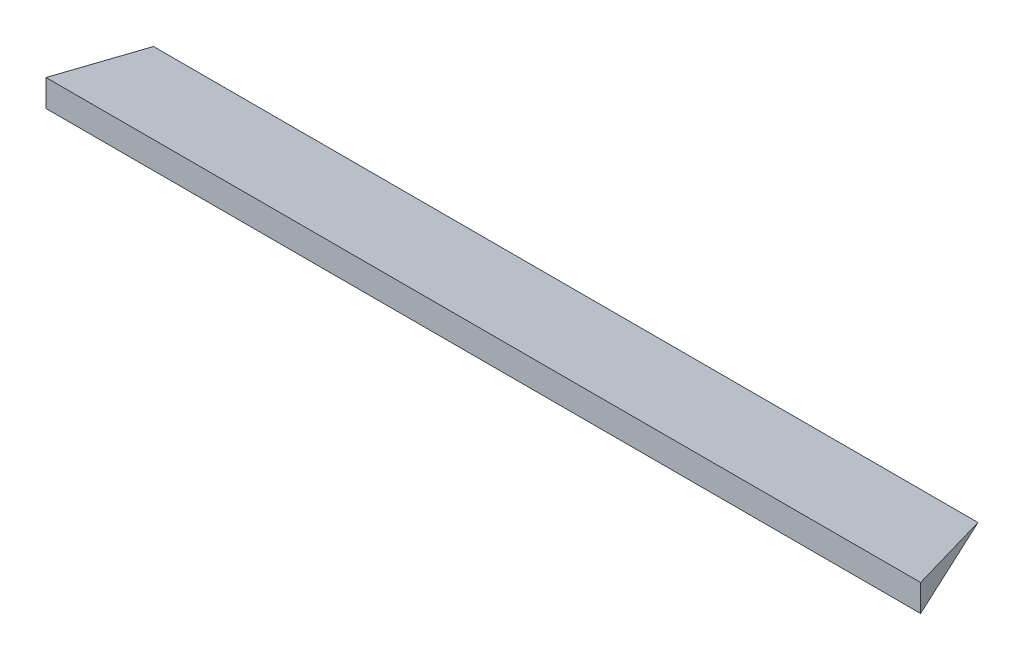
ISO-10303-21;
HEADER;
FILE_DESCRIPTION(('STEP AP214'),'2;1');
FILE_NAME('part.step','',(''),(''),'','','');
FILE_SCHEMA(('AUTOMOTIVE_DESIGN { 1 0 10303 214 1 1 1 1 }'));
ENDSEC;
DATA;
#1=APPLICATION_CONTEXT('core data for automotive mechanical design processes');
#2=APPLICATION_PROTOCOL_DEFINITION('international standard','automotive_design',2000,#1);
#3=PRODUCT_CONTEXT('',#1,'mechanical');
#4=PRODUCT('Part','Part','',(#3));
#5=PRODUCT_RELATED_PRODUCT_CATEGORY('part','',(#4));
#6=PRODUCT_DEFINITION_FORMATION('','',#4);
#7=PRODUCT_DEFINITION_CONTEXT('part definition',#1,'design');
#8=PRODUCT_DEFINITION('design','',#6,#7);
#9=PRODUCT_DEFINITION_SHAPE('','',#8);
#10=(LENGTH_UNIT() NAMED_UNIT(*) SI_UNIT(.MILLI.,.METRE.));
#11=(NAMED_UNIT(*) PLANE_ANGLE_UNIT() SI_UNIT($,.RADIAN.));
#12=(NAMED_UNIT(*) SI_UNIT($,.STERADIAN.) SOLID_ANGLE_UNIT());
#13=UNCERTAINTY_MEASURE_WITH_UNIT(LENGTH_MEASURE(1.E-05),#10,'distance_accuracy_value','');
#14=(GEOMETRIC_REPRESENTATION_CONTEXT(3) GLOBAL_UNCERTAINTY_ASSIGNED_CONTEXT((#13)) GLOBAL_UNIT_ASSIGNED_CONTEXT((#10,
#11,#12)) REPRESENTATION_CONTEXT('',''));
#15=CARTESIAN_POINT('',(0.,0.,0.));
#16=DIRECTION('',(0.,0.,1.));
#17=DIRECTION('',(1.,0.,0.));
#18=AXIS2_PLACEMENT_3D('',#15,#16,#17);
#19=CARTESIAN_POINT('',(310.,0.,-38.1));
#20=DIRECTION('',(0.,-0.970142500145332,0.242535625036333));
#21=DIRECTION('',(0.,-0.242535625036333,-0.970142500145332));
#22=AXIS2_PLACEMENT_3D('',#19,#20,#21);
#23=PLANE('',#22);
#24=DIRECTION('',(0.412170838384882,0.220975803837155,0.883903215348619));
#25=VECTOR('',#24,1.);
#26=CARTESIAN_POINT('',(295.251906246161,1.61815272014189,-31.6273891194324));
#27=LINE('',#26,#25);
#28=CARTESIAN_POINT('',(292.233678224295,0.,-38.1));
#29=VERTEX_POINT('',#28);
#30=CARTESIAN_POINT('',(310.,9.525,0.));
#31=VERTEX_POINT('',#30);
#32=EDGE_CURVE('E11',#29,#31,#27,.T.);
#33=ORIENTED_EDGE('',*,*,#32,.F.);
#34=DIRECTION('',(1.,0.,0.));
#35=VECTOR('',#34,1.);
#36=CARTESIAN_POINT('',(310.,0.,-38.1));
#37=LINE('',#36,#35);
#38=CARTESIAN_POINT('',(0.,0.,-38.1));
#39=VERTEX_POINT('',#38);
#40=EDGE_CURVE('E43',#29,#39,#37,.F.);
#41=ORIENTED_EDGE('',*,*,#40,.T.);
#42=DIRECTION('',(0.,0.242535625036333,0.970142500145332));
#43=VECTOR('',#42,1.);
#44=CARTESIAN_POINT('',(0.,0.,-38.1));
#45=LINE('',#44,#43);
#46=CARTESIAN_POINT('',(0.,9.525,0.));
#47=VERTEX_POINT('',#46);
#48=EDGE_CURVE('E80',#39,#47,#45,.T.);
#49=ORIENTED_EDGE('',*,*,#48,.T.);
#50=DIRECTION('',(-1.,0.,0.));
#51=VECTOR('',#50,1.);
#52=CARTESIAN_POINT('',(310.,9.525,0.));
#53=LINE('',#52,#51);
#54=EDGE_CURVE('E73',#31,#47,#53,.T.);
#55=ORIENTED_EDGE('',*,*,#54,.F.);
#56=EDGE_LOOP('',(#33,#41,#49,#55));
#57=FACE_BOUND('',#56,.T.);
#58=ADVANCED_FACE('F39',(#57),#23,.F.);
#59=CARTESIAN_POINT('',(310.,9.525,0.));
#60=DIRECTION('',(0.,0.,-1.));
#61=DIRECTION('',(0.,1.,0.));
#62=AXIS2_PLACEMENT_3D('',#59,#60,#61);
#63=PLANE('',#62);
#64=DIRECTION('',(0.,-1.,0.));
#65=VECTOR('',#64,1.);
#66=CARTESIAN_POINT('',(0.,9.525,0.));
#67=LINE('',#66,#65);
#68=CARTESIAN_POINT('',(0.,0.,0.));
#69=VERTEX_POINT('',#68);
#70=EDGE_CURVE('E93',#47,#69,#67,.T.);
#71=ORIENTED_EDGE('',*,*,#70,.T.);
#72=DIRECTION('',(-1.,0.,0.));
#73=VECTOR('',#72,1.);
#74=CARTESIAN_POINT('',(310.,0.,0.));
#75=LINE('',#74,#73);
#76=CARTESIAN_POINT('',(310.,0.,0.));
#77=VERTEX_POINT('',#76);
#78=EDGE_CURVE('E47',#77,#69,#75,.T.);
#79=ORIENTED_EDGE('',*,*,#78,.F.);
#80=DIRECTION('',(0.,-1.,0.));
#81=VECTOR('',#80,1.);
#82=CARTESIAN_POINT('',(310.,9.525,0.));
#83=LINE('',#82,#81);
#84=EDGE_CURVE('E68',#31,#77,#83,.T.);
#85=ORIENTED_EDGE('',*,*,#84,.F.);
#86=ORIENTED_EDGE('',*,*,#54,.T.);
#87=EDGE_LOOP('',(#71,#79,#85,#86));
#88=FACE_BOUND('',#87,.T.);
#89=ADVANCED_FACE('F41',(#88),#63,.F.);
#90=CARTESIAN_POINT('',(310.,0.,0.));
#91=DIRECTION('',(0.,1.,0.));
#92=DIRECTION('',(0.,0.,1.));
#93=AXIS2_PLACEMENT_3D('',#90,#91,#92);
#94=PLANE('',#93);
#95=ORIENTED_EDGE('',*,*,#40,.F.);
#96=DIRECTION('',(0.422618261740694,0.,0.906307787036652));
#97=VECTOR('',#96,1.);
#98=CARTESIAN_POINT('',(292.233678224295,0.,-38.1));
#99=LINE('',#98,#97);
#100=EDGE_CURVE('E57',#29,#77,#99,.T.);
#101=ORIENTED_EDGE('',*,*,#100,.T.);
#102=ORIENTED_EDGE('',*,*,#78,.T.);
#103=DIRECTION('',(0.,0.,-1.));
#104=VECTOR('',#103,1.);
#105=CARTESIAN_POINT('',(0.,0.,0.));
#106=LINE('',#105,#104);
#107=EDGE_CURVE('E83',#69,#39,#106,.T.);
#108=ORIENTED_EDGE('',*,*,#107,.T.);
#109=EDGE_LOOP('',(#95,#101,#102,#108));
#110=FACE_BOUND('',#109,.T.);
#111=ADVANCED_FACE('F92',(#110),#94,.F.);
#112=CARTESIAN_POINT('',(0.,0.,0.));
#113=DIRECTION('',(1.,0.,0.));
#114=DIRECTION('',(0.,0.,-1.));
#115=AXIS2_PLACEMENT_3D('',#112,#113,#114);
#116=PLANE('',#115);
#117=ORIENTED_EDGE('',*,*,#70,.F.);
#118=ORIENTED_EDGE('',*,*,#48,.F.);
#119=ORIENTED_EDGE('',*,*,#107,.F.);
#120=EDGE_LOOP('',(#117,#118,#119));
#121=FACE_BOUND('',#120,.T.);
#122=ADVANCED_FACE('F94',(#121),#116,.F.);
#123=CARTESIAN_POINT('',(310.,9.525,0.));
#124=DIRECTION('',(0.906307787036652,0.,-0.422618261740695));
#125=DIRECTION('',(-0.422618261740695,0.,-0.906307787036652));
#126=AXIS2_PLACEMENT_3D('',#123,#124,#125);
#127=PLANE('',#126);
#128=ORIENTED_EDGE('',*,*,#32,.T.);
#129=ORIENTED_EDGE('',*,*,#84,.T.);
#130=ORIENTED_EDGE('',*,*,#100,.F.);
#131=EDGE_LOOP('',(#128,#129,#130));
#132=FACE_BOUND('',#131,.T.);
#133=ADVANCED_FACE('F70',(#132),#127,.T.);
#134=CLOSED_SHELL('',(#58,#89,#111,#122,#133));
#135=MANIFOLD_SOLID_BREP('B2',#134);
#136=ADVANCED_BREP_SHAPE_REPRESENTATION('',(#18,#135),#14);
#137=SHAPE_DEFINITION_REPRESENTATION(#9,#136);
ENDSEC;
END-ISO-10303-21;
